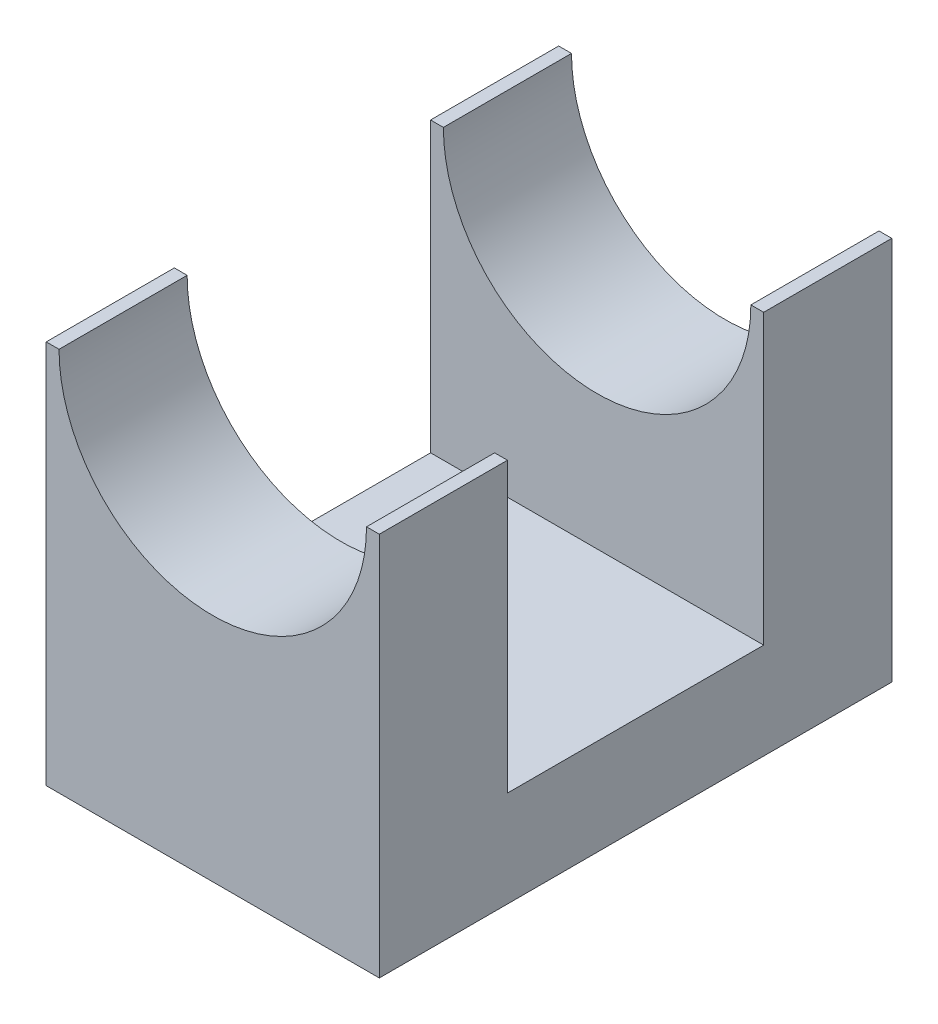
ISO-10303-21;
HEADER;
FILE_DESCRIPTION(('STEP AP214'),'2;1');
FILE_NAME('part.step','',(''),(''),'','','');
FILE_SCHEMA(('AUTOMOTIVE_DESIGN { 1 0 10303 214 1 1 1 1 }'));
ENDSEC;
DATA;
#1=APPLICATION_CONTEXT('core data for automotive mechanical design processes');
#2=APPLICATION_PROTOCOL_DEFINITION('international standard','automotive_design',2000,#1);
#3=PRODUCT_CONTEXT('',#1,'mechanical');
#4=PRODUCT('Part','Part','',(#3));
#5=PRODUCT_RELATED_PRODUCT_CATEGORY('part','',(#4));
#6=PRODUCT_DEFINITION_FORMATION('','',#4);
#7=PRODUCT_DEFINITION_CONTEXT('part definition',#1,'design');
#8=PRODUCT_DEFINITION('design','',#6,#7);
#9=PRODUCT_DEFINITION_SHAPE('','',#8);
#10=(LENGTH_UNIT() NAMED_UNIT(*) SI_UNIT(.MILLI.,.METRE.));
#11=(NAMED_UNIT(*) PLANE_ANGLE_UNIT() SI_UNIT($,.RADIAN.));
#12=(NAMED_UNIT(*) SI_UNIT($,.STERADIAN.) SOLID_ANGLE_UNIT());
#13=UNCERTAINTY_MEASURE_WITH_UNIT(LENGTH_MEASURE(1.E-05),#10,'distance_accuracy_value','');
#14=(GEOMETRIC_REPRESENTATION_CONTEXT(3) GLOBAL_UNCERTAINTY_ASSIGNED_CONTEXT((#13)) GLOBAL_UNIT_ASSIGNED_CONTEXT((#10,
#11,#12)) REPRESENTATION_CONTEXT('',''));
#15=CARTESIAN_POINT('',(0.,0.,0.));
#16=DIRECTION('',(0.,0.,1.));
#17=DIRECTION('',(1.,0.,0.));
#18=AXIS2_PLACEMENT_3D('',#15,#16,#17);
#19=CARTESIAN_POINT('',(0.,0.,0.));
#20=DIRECTION('',(0.,0.,1.));
#21=DIRECTION('',(1.,0.,0.));
#22=AXIS2_PLACEMENT_3D('',#19,#20,#21);
#23=PLANE('',#22);
#24=DIRECTION('',(1.,0.,0.));
#25=VECTOR('',#24,1.);
#26=CARTESIAN_POINT('',(52.,-90.,0.));
#27=LINE('',#26,#25);
#28=CARTESIAN_POINT('',(-52.,-90.,0.));
#29=VERTEX_POINT('',#28);
#30=CARTESIAN_POINT('',(52.,-90.,0.));
#31=VERTEX_POINT('',#30);
#32=EDGE_CURVE('E59',#29,#31,#27,.T.);
#33=ORIENTED_EDGE('',*,*,#32,.F.);
#34=DIRECTION('',(0.,-1.,0.));
#35=VECTOR('',#34,1.);
#36=CARTESIAN_POINT('',(-52.,0.,0.));
#37=LINE('',#36,#35);
#38=CARTESIAN_POINT('',(-52.,0.,0.));
#39=VERTEX_POINT('',#38);
#40=EDGE_CURVE('E142',#39,#29,#37,.T.);
#41=ORIENTED_EDGE('',*,*,#40,.F.);
#42=DIRECTION('',(-1.,0.,0.));
#43=VECTOR('',#42,1.);
#44=CARTESIAN_POINT('',(-52.,0.,0.));
#45=LINE('',#44,#43);
#46=CARTESIAN_POINT('',(-48.,0.,0.));
#47=VERTEX_POINT('',#46);
#48=EDGE_CURVE('E138',#47,#39,#45,.T.);
#49=ORIENTED_EDGE('',*,*,#48,.F.);
#50=CARTESIAN_POINT('',(0.,0.,0.));
#51=DIRECTION('',(0.,0.,-1.));
#52=DIRECTION('',(1.,0.,0.));
#53=AXIS2_PLACEMENT_3D('',#50,#51,#52);
#54=CIRCLE('',#53,48.);
#55=CARTESIAN_POINT('',(48.,0.,0.));
#56=VERTEX_POINT('',#55);
#57=EDGE_CURVE('E88',#56,#47,#54,.T.);
#58=ORIENTED_EDGE('',*,*,#57,.F.);
#59=DIRECTION('',(-1.,0.,0.));
#60=VECTOR('',#59,1.);
#61=CARTESIAN_POINT('',(48.,0.,0.));
#62=LINE('',#61,#60);
#63=CARTESIAN_POINT('',(52.,0.,0.));
#64=VERTEX_POINT('',#63);
#65=EDGE_CURVE('E148',#64,#56,#62,.T.);
#66=ORIENTED_EDGE('',*,*,#65,.F.);
#67=DIRECTION('',(0.,1.,0.));
#68=VECTOR('',#67,1.);
#69=CARTESIAN_POINT('',(52.,-120.,0.));
#70=LINE('',#69,#68);
#71=EDGE_CURVE('E123',#31,#64,#70,.T.);
#72=ORIENTED_EDGE('',*,*,#71,.F.);
#73=EDGE_LOOP('',(#33,#41,#49,#58,#66,#72));
#74=FACE_BOUND('',#73,.T.);
#75=ADVANCED_FACE('F43',(#74),#23,.F.);
#76=CARTESIAN_POINT('',(-52.,0.,40.));
#77=DIRECTION('',(0.,-1.,0.));
#78=DIRECTION('',(1.,0.,0.));
#79=AXIS2_PLACEMENT_3D('',#76,#77,#78);
#80=PLANE('',#79);
#81=ORIENTED_EDGE('',*,*,#48,.T.);
#82=DIRECTION('',(0.,0.,-1.));
#83=VECTOR('',#82,1.);
#84=CARTESIAN_POINT('',(-52.,0.,40.));
#85=LINE('',#84,#83);
#86=CARTESIAN_POINT('',(-52.,0.,40.));
#87=VERTEX_POINT('',#86);
#88=EDGE_CURVE('E11',#87,#39,#85,.T.);
#89=ORIENTED_EDGE('',*,*,#88,.F.);
#90=DIRECTION('',(-1.,0.,0.));
#91=VECTOR('',#90,1.);
#92=CARTESIAN_POINT('',(-52.,0.,40.));
#93=LINE('',#92,#91);
#94=CARTESIAN_POINT('',(-48.,0.,40.));
#95=VERTEX_POINT('',#94);
#96=EDGE_CURVE('E153',#95,#87,#93,.T.);
#97=ORIENTED_EDGE('',*,*,#96,.F.);
#98=DIRECTION('',(0.,0.,-1.));
#99=VECTOR('',#98,1.);
#100=CARTESIAN_POINT('',(-48.,0.,40.));
#101=LINE('',#100,#99);
#102=EDGE_CURVE('E134',#95,#47,#101,.T.);
#103=ORIENTED_EDGE('',*,*,#102,.T.);
#104=EDGE_LOOP('',(#81,#89,#97,#103));
#105=FACE_BOUND('',#104,.T.);
#106=ADVANCED_FACE('F45',(#105),#80,.F.);
#107=CARTESIAN_POINT('',(-52.,0.,40.));
#108=DIRECTION('',(1.,0.,0.));
#109=DIRECTION('',(0.,0.,-1.));
#110=AXIS2_PLACEMENT_3D('',#107,#108,#109);
#111=PLANE('',#110);
#112=ORIENTED_EDGE('',*,*,#40,.T.);
#113=DIRECTION('',(0.,0.,1.));
#114=VECTOR('',#113,1.);
#115=CARTESIAN_POINT('',(-52.,-90.,-80.));
#116=LINE('',#115,#114);
#117=CARTESIAN_POINT('',(-52.,-90.,-80.));
#118=VERTEX_POINT('',#117);
#119=EDGE_CURVE('E143',#118,#29,#116,.T.);
#120=ORIENTED_EDGE('',*,*,#119,.F.);
#121=DIRECTION('',(0.,-1.,0.));
#122=VECTOR('',#121,1.);
#123=CARTESIAN_POINT('',(-52.,0.,-80.));
#124=LINE('',#123,#122);
#125=CARTESIAN_POINT('',(-52.,0.,-80.));
#126=VERTEX_POINT('',#125);
#127=EDGE_CURVE('E211',#126,#118,#124,.T.);
#128=ORIENTED_EDGE('',*,*,#127,.F.);
#129=DIRECTION('',(0.,0.,1.));
#130=VECTOR('',#129,1.);
#131=CARTESIAN_POINT('',(-52.,0.,-120.));
#132=LINE('',#131,#130);
#133=CARTESIAN_POINT('',(-52.,0.,-120.));
#134=VERTEX_POINT('',#133);
#135=EDGE_CURVE('E187',#134,#126,#132,.T.);
#136=ORIENTED_EDGE('',*,*,#135,.F.);
#137=DIRECTION('',(0.,-1.,0.));
#138=VECTOR('',#137,1.);
#139=CARTESIAN_POINT('',(-52.,0.,-120.));
#140=LINE('',#139,#138);
#141=CARTESIAN_POINT('',(-52.,-120.,-120.));
#142=VERTEX_POINT('',#141);
#143=EDGE_CURVE('E177',#134,#142,#140,.T.);
#144=ORIENTED_EDGE('',*,*,#143,.T.);
#145=DIRECTION('',(0.,0.,-1.));
#146=VECTOR('',#145,1.);
#147=CARTESIAN_POINT('',(-52.,-120.,40.));
#148=LINE('',#147,#146);
#149=CARTESIAN_POINT('',(-52.,-120.,40.));
#150=VERTEX_POINT('',#149);
#151=EDGE_CURVE('E52',#150,#142,#148,.T.);
#152=ORIENTED_EDGE('',*,*,#151,.F.);
#153=DIRECTION('',(0.,-1.,0.));
#154=VECTOR('',#153,1.);
#155=CARTESIAN_POINT('',(-52.,0.,40.));
#156=LINE('',#155,#154);
#157=EDGE_CURVE('E96',#87,#150,#156,.T.);
#158=ORIENTED_EDGE('',*,*,#157,.F.);
#159=ORIENTED_EDGE('',*,*,#88,.T.);
#160=EDGE_LOOP('',(#112,#120,#128,#136,#144,#152,#158,#159));
#161=FACE_BOUND('',#160,.T.);
#162=ADVANCED_FACE('F184',(#161),#111,.F.);
#163=CARTESIAN_POINT('',(-52.,-120.,40.));
#164=DIRECTION('',(0.,1.,0.));
#165=DIRECTION('',(0.,0.,1.));
#166=AXIS2_PLACEMENT_3D('',#163,#164,#165);
#167=PLANE('',#166);
#168=ORIENTED_EDGE('',*,*,#151,.T.);
#169=DIRECTION('',(1.,0.,0.));
#170=VECTOR('',#169,1.);
#171=CARTESIAN_POINT('',(0.,-120.,-120.));
#172=LINE('',#171,#170);
#173=CARTESIAN_POINT('',(52.,-120.,-120.));
#174=VERTEX_POINT('',#173);
#175=EDGE_CURVE('E167',#142,#174,#172,.T.);
#176=ORIENTED_EDGE('',*,*,#175,.T.);
#177=DIRECTION('',(0.,0.,-1.));
#178=VECTOR('',#177,1.);
#179=CARTESIAN_POINT('',(52.,-120.,40.));
#180=LINE('',#179,#178);
#181=CARTESIAN_POINT('',(52.,-120.,40.));
#182=VERTEX_POINT('',#181);
#183=EDGE_CURVE('E127',#182,#174,#180,.T.);
#184=ORIENTED_EDGE('',*,*,#183,.F.);
#185=DIRECTION('',(1.,0.,0.));
#186=VECTOR('',#185,1.);
#187=CARTESIAN_POINT('',(-52.,-120.,40.));
#188=LINE('',#187,#186);
#189=EDGE_CURVE('E113',#150,#182,#188,.T.);
#190=ORIENTED_EDGE('',*,*,#189,.F.);
#191=EDGE_LOOP('',(#168,#176,#184,#190));
#192=FACE_BOUND('',#191,.T.);
#193=ADVANCED_FACE('F165',(#192),#167,.F.);
#194=CARTESIAN_POINT('',(52.,-120.,40.));
#195=DIRECTION('',(-1.,0.,0.));
#196=DIRECTION('',(0.,-1.,0.));
#197=AXIS2_PLACEMENT_3D('',#194,#195,#196);
#198=PLANE('',#197);
#199=ORIENTED_EDGE('',*,*,#183,.T.);
#200=DIRECTION('',(0.,1.,0.));
#201=VECTOR('',#200,1.);
#202=CARTESIAN_POINT('',(52.,0.,-120.));
#203=LINE('',#202,#201);
#204=CARTESIAN_POINT('',(52.,0.,-120.));
#205=VERTEX_POINT('',#204);
#206=EDGE_CURVE('E180',#174,#205,#203,.T.);
#207=ORIENTED_EDGE('',*,*,#206,.T.);
#208=DIRECTION('',(0.,0.,1.));
#209=VECTOR('',#208,1.);
#210=CARTESIAN_POINT('',(52.,0.,-120.));
#211=LINE('',#210,#209);
#212=CARTESIAN_POINT('',(52.,0.,-80.));
#213=VERTEX_POINT('',#212);
#214=EDGE_CURVE('E220',#205,#213,#211,.T.);
#215=ORIENTED_EDGE('',*,*,#214,.T.);
#216=DIRECTION('',(0.,1.,0.));
#217=VECTOR('',#216,1.);
#218=CARTESIAN_POINT('',(52.,0.,-80.));
#219=LINE('',#218,#217);
#220=CARTESIAN_POINT('',(52.,-90.,-80.));
#221=VERTEX_POINT('',#220);
#222=EDGE_CURVE('E215',#221,#213,#219,.T.);
#223=ORIENTED_EDGE('',*,*,#222,.F.);
#224=DIRECTION('',(0.,0.,1.));
#225=VECTOR('',#224,1.);
#226=CARTESIAN_POINT('',(52.,-90.,-80.));
#227=LINE('',#226,#225);
#228=EDGE_CURVE('E237',#221,#31,#227,.T.);
#229=ORIENTED_EDGE('',*,*,#228,.T.);
#230=ORIENTED_EDGE('',*,*,#71,.T.);
#231=DIRECTION('',(0.,0.,-1.));
#232=VECTOR('',#231,1.);
#233=CARTESIAN_POINT('',(52.,0.,40.));
#234=LINE('',#233,#232);
#235=CARTESIAN_POINT('',(52.,0.,40.));
#236=VERTEX_POINT('',#235);
#237=EDGE_CURVE('E120',#236,#64,#234,.T.);
#238=ORIENTED_EDGE('',*,*,#237,.F.);
#239=DIRECTION('',(0.,1.,0.));
#240=VECTOR('',#239,1.);
#241=CARTESIAN_POINT('',(52.,-120.,40.));
#242=LINE('',#241,#240);
#243=EDGE_CURVE('E106',#182,#236,#242,.T.);
#244=ORIENTED_EDGE('',*,*,#243,.F.);
#245=EDGE_LOOP('',(#199,#207,#215,#223,#229,#230,#238,#244));
#246=FACE_BOUND('',#245,.T.);
#247=ADVANCED_FACE('F121',(#246),#198,.F.);
#248=CARTESIAN_POINT('',(48.,0.,40.));
#249=DIRECTION('',(0.,-1.,0.));
#250=DIRECTION('',(1.,0.,0.));
#251=AXIS2_PLACEMENT_3D('',#248,#249,#250);
#252=PLANE('',#251);
#253=ORIENTED_EDGE('',*,*,#65,.T.);
#254=DIRECTION('',(0.,0.,-1.));
#255=VECTOR('',#254,1.);
#256=CARTESIAN_POINT('',(48.,0.,40.));
#257=LINE('',#256,#255);
#258=CARTESIAN_POINT('',(48.,0.,40.));
#259=VERTEX_POINT('',#258);
#260=EDGE_CURVE('E128',#259,#56,#257,.T.);
#261=ORIENTED_EDGE('',*,*,#260,.F.);
#262=DIRECTION('',(-1.,0.,0.));
#263=VECTOR('',#262,1.);
#264=CARTESIAN_POINT('',(48.,0.,40.));
#265=LINE('',#264,#263);
#266=EDGE_CURVE('E110',#236,#259,#265,.T.);
#267=ORIENTED_EDGE('',*,*,#266,.F.);
#268=ORIENTED_EDGE('',*,*,#237,.T.);
#269=EDGE_LOOP('',(#253,#261,#267,#268));
#270=FACE_BOUND('',#269,.T.);
#271=ADVANCED_FACE('F130',(#270),#252,.F.);
#272=CARTESIAN_POINT('',(0.,0.,40.));
#273=DIRECTION('',(0.,0.,-1.));
#274=DIRECTION('',(-1.,0.,0.));
#275=AXIS2_PLACEMENT_3D('',#272,#273,#274);
#276=CYLINDRICAL_SURFACE('',#275,48.);
#277=ORIENTED_EDGE('',*,*,#57,.T.);
#278=ORIENTED_EDGE('',*,*,#102,.F.);
#279=CARTESIAN_POINT('',(0.,0.,40.));
#280=DIRECTION('',(0.,0.,-1.));
#281=DIRECTION('',(1.,0.,0.));
#282=AXIS2_PLACEMENT_3D('',#279,#280,#281);
#283=CIRCLE('',#282,48.);
#284=EDGE_CURVE('E68',#259,#95,#283,.T.);
#285=ORIENTED_EDGE('',*,*,#284,.F.);
#286=ORIENTED_EDGE('',*,*,#260,.T.);
#287=EDGE_LOOP('',(#277,#278,#285,#286));
#288=FACE_BOUND('',#287,.T.);
#289=ADVANCED_FACE('F314',(#288),#276,.F.);
#290=CARTESIAN_POINT('',(0.,0.,40.));
#291=DIRECTION('',(0.,0.,1.));
#292=DIRECTION('',(1.,0.,0.));
#293=AXIS2_PLACEMENT_3D('',#290,#291,#292);
#294=PLANE('',#293);
#295=ORIENTED_EDGE('',*,*,#96,.T.);
#296=ORIENTED_EDGE('',*,*,#157,.T.);
#297=ORIENTED_EDGE('',*,*,#189,.T.);
#298=ORIENTED_EDGE('',*,*,#243,.T.);
#299=ORIENTED_EDGE('',*,*,#266,.T.);
#300=ORIENTED_EDGE('',*,*,#284,.T.);
#301=EDGE_LOOP('',(#295,#296,#297,#298,#299,#300));
#302=FACE_BOUND('',#301,.T.);
#303=ADVANCED_FACE('F108',(#302),#294,.T.);
#304=CARTESIAN_POINT('',(52.,-90.,-80.));
#305=DIRECTION('',(0.,-1.,0.));
#306=DIRECTION('',(0.,0.,-1.));
#307=AXIS2_PLACEMENT_3D('',#304,#305,#306);
#308=PLANE('',#307);
#309=ORIENTED_EDGE('',*,*,#32,.T.);
#310=ORIENTED_EDGE('',*,*,#228,.F.);
#311=DIRECTION('',(1.,0.,0.));
#312=VECTOR('',#311,1.);
#313=CARTESIAN_POINT('',(52.,-90.,-80.));
#314=LINE('',#313,#312);
#315=EDGE_CURVE('E233',#118,#221,#314,.T.);
#316=ORIENTED_EDGE('',*,*,#315,.F.);
#317=ORIENTED_EDGE('',*,*,#119,.T.);
#318=EDGE_LOOP('',(#309,#310,#316,#317));
#319=FACE_BOUND('',#318,.T.);
#320=ADVANCED_FACE('F256',(#319),#308,.F.);
#321=CARTESIAN_POINT('',(0.,0.,-120.));
#322=DIRECTION('',(0.,1.,0.));
#323=DIRECTION('',(-1.,0.,0.));
#324=AXIS2_PLACEMENT_3D('',#321,#322,#323);
#325=PLANE('',#324);
#326=DIRECTION('',(-1.,0.,0.));
#327=VECTOR('',#326,1.);
#328=CARTESIAN_POINT('',(0.,0.,-80.));
#329=LINE('',#328,#327);
#330=CARTESIAN_POINT('',(48.,0.,-80.));
#331=VERTEX_POINT('',#330);
#332=EDGE_CURVE('E199',#213,#331,#329,.T.);
#333=ORIENTED_EDGE('',*,*,#332,.F.);
#334=ORIENTED_EDGE('',*,*,#214,.F.);
#335=DIRECTION('',(-1.,0.,0.));
#336=VECTOR('',#335,1.);
#337=CARTESIAN_POINT('',(0.,0.,-120.));
#338=LINE('',#337,#336);
#339=CARTESIAN_POINT('',(48.,0.,-120.));
#340=VERTEX_POINT('',#339);
#341=EDGE_CURVE('E219',#205,#340,#338,.T.);
#342=ORIENTED_EDGE('',*,*,#341,.T.);
#343=DIRECTION('',(0.,0.,1.));
#344=VECTOR('',#343,1.);
#345=CARTESIAN_POINT('',(48.,0.,-120.));
#346=LINE('',#345,#344);
#347=EDGE_CURVE('E198',#340,#331,#346,.T.);
#348=ORIENTED_EDGE('',*,*,#347,.T.);
#349=EDGE_LOOP('',(#333,#334,#342,#348));
#350=FACE_BOUND('',#349,.T.);
#351=ADVANCED_FACE('F283',(#350),#325,.T.);
#352=CARTESIAN_POINT('',(0.,0.,-120.));
#353=DIRECTION('',(0.,1.,0.));
#354=DIRECTION('',(-1.,0.,0.));
#355=AXIS2_PLACEMENT_3D('',#352,#353,#354);
#356=PLANE('',#355);
#357=DIRECTION('',(-1.,0.,0.));
#358=VECTOR('',#357,1.);
#359=CARTESIAN_POINT('',(0.,0.,-80.));
#360=LINE('',#359,#358);
#361=CARTESIAN_POINT('',(-48.,0.,-80.));
#362=VERTEX_POINT('',#361);
#363=EDGE_CURVE('E207',#362,#126,#360,.T.);
#364=ORIENTED_EDGE('',*,*,#363,.F.);
#365=DIRECTION('',(0.,0.,1.));
#366=VECTOR('',#365,1.);
#367=CARTESIAN_POINT('',(-48.,0.,-120.));
#368=LINE('',#367,#366);
#369=CARTESIAN_POINT('',(-48.,0.,-120.));
#370=VERTEX_POINT('',#369);
#371=EDGE_CURVE('E226',#370,#362,#368,.T.);
#372=ORIENTED_EDGE('',*,*,#371,.F.);
#373=DIRECTION('',(-1.,0.,0.));
#374=VECTOR('',#373,1.);
#375=CARTESIAN_POINT('',(0.,0.,-120.));
#376=LINE('',#375,#374);
#377=EDGE_CURVE('E189',#370,#134,#376,.T.);
#378=ORIENTED_EDGE('',*,*,#377,.T.);
#379=ORIENTED_EDGE('',*,*,#135,.T.);
#380=EDGE_LOOP('',(#364,#372,#378,#379));
#381=FACE_BOUND('',#380,.T.);
#382=ADVANCED_FACE('F288',(#381),#356,.T.);
#383=CARTESIAN_POINT('',(0.,0.,-120.));
#384=DIRECTION('',(0.,0.,1.));
#385=DIRECTION('',(1.,0.,0.));
#386=AXIS2_PLACEMENT_3D('',#383,#384,#385);
#387=CYLINDRICAL_SURFACE('',#386,48.);
#388=CARTESIAN_POINT('',(0.,0.,-80.));
#389=DIRECTION('',(0.,0.,1.));
#390=DIRECTION('',(1.,0.,0.));
#391=AXIS2_PLACEMENT_3D('',#388,#389,#390);
#392=CIRCLE('',#391,48.);
#393=EDGE_CURVE('E203',#362,#331,#392,.T.);
#394=ORIENTED_EDGE('',*,*,#393,.T.);
#395=ORIENTED_EDGE('',*,*,#347,.F.);
#396=CARTESIAN_POINT('',(0.,0.,-120.));
#397=DIRECTION('',(0.,0.,1.));
#398=DIRECTION('',(1.,0.,0.));
#399=AXIS2_PLACEMENT_3D('',#396,#397,#398);
#400=CIRCLE('',#399,48.);
#401=EDGE_CURVE('E192',#370,#340,#400,.T.);
#402=ORIENTED_EDGE('',*,*,#401,.F.);
#403=ORIENTED_EDGE('',*,*,#371,.T.);
#404=EDGE_LOOP('',(#394,#395,#402,#403));
#405=FACE_BOUND('',#404,.T.);
#406=ADVANCED_FACE('F286',(#405),#387,.F.);
#407=CARTESIAN_POINT('',(0.,0.,-120.));
#408=DIRECTION('',(0.,0.,1.));
#409=DIRECTION('',(1.,0.,0.));
#410=AXIS2_PLACEMENT_3D('',#407,#408,#409);
#411=PLANE('',#410);
#412=ORIENTED_EDGE('',*,*,#341,.F.);
#413=ORIENTED_EDGE('',*,*,#206,.F.);
#414=ORIENTED_EDGE('',*,*,#175,.F.);
#415=ORIENTED_EDGE('',*,*,#143,.F.);
#416=ORIENTED_EDGE('',*,*,#377,.F.);
#417=ORIENTED_EDGE('',*,*,#401,.T.);
#418=EDGE_LOOP('',(#412,#413,#414,#415,#416,#417));
#419=FACE_BOUND('',#418,.T.);
#420=ADVANCED_FACE('F175',(#419),#411,.F.);
#421=CARTESIAN_POINT('',(0.,0.,-80.));
#422=DIRECTION('',(0.,0.,1.));
#423=DIRECTION('',(1.,0.,0.));
#424=AXIS2_PLACEMENT_3D('',#421,#422,#423);
#425=PLANE('',#424);
#426=ORIENTED_EDGE('',*,*,#127,.T.);
#427=ORIENTED_EDGE('',*,*,#315,.T.);
#428=ORIENTED_EDGE('',*,*,#222,.T.);
#429=ORIENTED_EDGE('',*,*,#332,.T.);
#430=ORIENTED_EDGE('',*,*,#393,.F.);
#431=ORIENTED_EDGE('',*,*,#363,.T.);
#432=EDGE_LOOP('',(#426,#427,#428,#429,#430,#431));
#433=FACE_BOUND('',#432,.T.);
#434=ADVANCED_FACE('F261',(#433),#425,.T.);
#435=CLOSED_SHELL('',(#75,#106,#162,#193,#247,#271,#289,#303,#320,#351,#382,#406,#420,#434));
#436=MANIFOLD_SOLID_BREP('B2',#435);
#437=ADVANCED_BREP_SHAPE_REPRESENTATION('',(#18,#436),#14);
#438=SHAPE_DEFINITION_REPRESENTATION(#9,#437);
ENDSEC;
END-ISO-10303-21;
